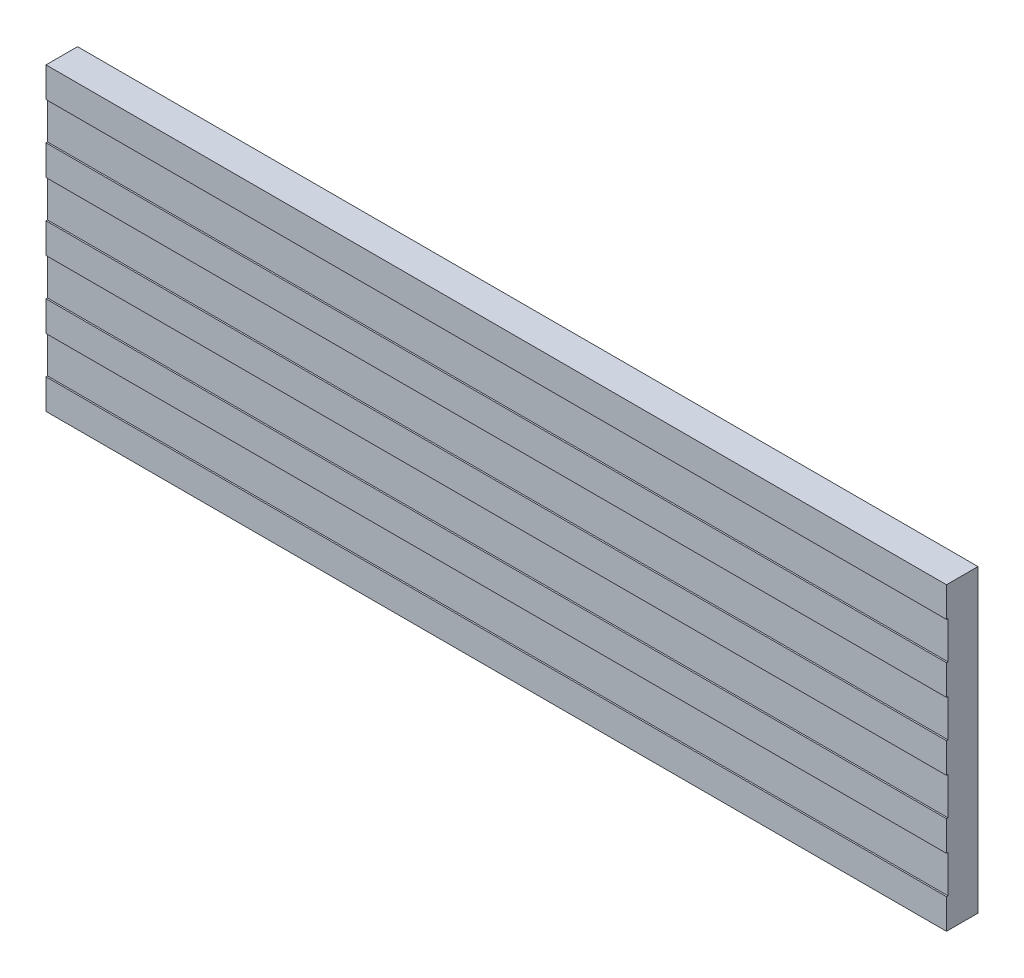
ISO-10303-21;
HEADER;
FILE_DESCRIPTION(('STEP AP214'),'2;1');
FILE_NAME('part.step','',(''),(''),'','','');
FILE_SCHEMA(('AUTOMOTIVE_DESIGN { 1 0 10303 214 1 1 1 1 }'));
ENDSEC;
DATA;
#1=APPLICATION_CONTEXT('core data for automotive mechanical design processes');
#2=APPLICATION_PROTOCOL_DEFINITION('international standard','automotive_design',2000,#1);
#3=PRODUCT_CONTEXT('',#1,'mechanical');
#4=PRODUCT('Part','Part','',(#3));
#5=PRODUCT_RELATED_PRODUCT_CATEGORY('part','',(#4));
#6=PRODUCT_DEFINITION_FORMATION('','',#4);
#7=PRODUCT_DEFINITION_CONTEXT('part definition',#1,'design');
#8=PRODUCT_DEFINITION('design','',#6,#7);
#9=PRODUCT_DEFINITION_SHAPE('','',#8);
#10=(LENGTH_UNIT() NAMED_UNIT(*) SI_UNIT(.MILLI.,.METRE.));
#11=(NAMED_UNIT(*) PLANE_ANGLE_UNIT() SI_UNIT($,.RADIAN.));
#12=(NAMED_UNIT(*) SI_UNIT($,.STERADIAN.) SOLID_ANGLE_UNIT());
#13=UNCERTAINTY_MEASURE_WITH_UNIT(LENGTH_MEASURE(1.E-05),#10,'distance_accuracy_value','');
#14=(GEOMETRIC_REPRESENTATION_CONTEXT(3) GLOBAL_UNCERTAINTY_ASSIGNED_CONTEXT((#13)) GLOBAL_UNIT_ASSIGNED_CONTEXT((#10,
#11,#12)) REPRESENTATION_CONTEXT('',''));
#15=CARTESIAN_POINT('',(0.,0.,0.));
#16=DIRECTION('',(0.,0.,1.));
#17=DIRECTION('',(1.,0.,0.));
#18=AXIS2_PLACEMENT_3D('',#15,#16,#17);
#19=CARTESIAN_POINT('',(0.,0.,20.));
#20=DIRECTION('',(0.,0.,1.));
#21=DIRECTION('',(1.,0.,0.));
#22=AXIS2_PLACEMENT_3D('',#19,#20,#21);
#23=PLANE('',#22);
#24=DIRECTION('',(0.,-1.,0.));
#25=VECTOR('',#24,1.);
#26=CARTESIAN_POINT('',(-45.0098837978771,19.9904232510125,20.));
#27=LINE('',#26,#25);
#28=CARTESIAN_POINT('',(-45.0098837978771,-135.009576748988,20.));
#29=VERTEX_POINT('',#28);
#30=CARTESIAN_POINT('',(-45.0098837978771,-160.009576748988,20.));
#31=VERTEX_POINT('',#30);
#32=EDGE_CURVE('E50',#29,#31,#27,.T.);
#33=ORIENTED_EDGE('',*,*,#32,.T.);
#34=DIRECTION('',(-1.,0.,0.));
#35=VECTOR('',#34,1.);
#36=CARTESIAN_POINT('',(554.990116202123,-160.009576748988,20.));
#37=LINE('',#36,#35);
#38=CARTESIAN_POINT('',(554.990116202123,-160.009576748988,20.));
#39=VERTEX_POINT('',#38);
#40=EDGE_CURVE('E191',#39,#31,#37,.T.);
#41=ORIENTED_EDGE('',*,*,#40,.F.);
#42=DIRECTION('',(0.,1.,0.));
#43=VECTOR('',#42,1.);
#44=CARTESIAN_POINT('',(554.990116202123,19.9904232510125,20.));
#45=LINE('',#44,#43);
#46=CARTESIAN_POINT('',(554.990116202123,-135.009576748988,20.));
#47=VERTEX_POINT('',#46);
#48=EDGE_CURVE('E36',#39,#47,#45,.T.);
#49=ORIENTED_EDGE('',*,*,#48,.T.);
#50=DIRECTION('',(1.,0.,0.));
#51=VECTOR('',#50,1.);
#52=CARTESIAN_POINT('',(-45.0098837978771,-135.009576748988,20.));
#53=LINE('',#52,#51);
#54=EDGE_CURVE('E55',#29,#47,#53,.T.);
#55=ORIENTED_EDGE('',*,*,#54,.F.);
#56=EDGE_LOOP('',(#33,#41,#49,#55));
#57=FACE_BOUND('',#56,.T.);
#58=ADVANCED_FACE('F32',(#57),#23,.T.);
#59=CARTESIAN_POINT('',(-45.0098837978771,-90.0095767489876,20.));
#60=VERTEX_POINT('',#59);
#61=CARTESIAN_POINT('',(-45.0098837978771,-115.009576748988,20.));
#62=VERTEX_POINT('',#61);
#63=EDGE_CURVE('E307',#60,#62,#27,.T.);
#64=ORIENTED_EDGE('',*,*,#63,.T.);
#65=DIRECTION('',(-1.,0.,0.));
#66=VECTOR('',#65,1.);
#67=CARTESIAN_POINT('',(-45.0098837978771,-115.009576748988,20.));
#68=LINE('',#67,#66);
#69=CARTESIAN_POINT('',(554.990116202123,-115.009576748988,20.));
#70=VERTEX_POINT('',#69);
#71=EDGE_CURVE('E196',#70,#62,#68,.T.);
#72=ORIENTED_EDGE('',*,*,#71,.F.);
#73=CARTESIAN_POINT('',(554.990116202123,-90.0095767489876,20.));
#74=VERTEX_POINT('',#73);
#75=EDGE_CURVE('E319',#70,#74,#45,.T.);
#76=ORIENTED_EDGE('',*,*,#75,.T.);
#77=DIRECTION('',(1.,0.,0.));
#78=VECTOR('',#77,1.);
#79=CARTESIAN_POINT('',(-45.0098837978771,-90.0095767489876,20.));
#80=LINE('',#79,#78);
#81=EDGE_CURVE('E223',#60,#74,#80,.T.);
#82=ORIENTED_EDGE('',*,*,#81,.F.);
#83=EDGE_LOOP('',(#64,#72,#76,#82));
#84=FACE_BOUND('',#83,.T.);
#85=ADVANCED_FACE('F361',(#84),#23,.T.);
#86=CARTESIAN_POINT('',(-45.0098837978771,-45.0095767489876,20.));
#87=VERTEX_POINT('',#86);
#88=CARTESIAN_POINT('',(-45.0098837978771,-70.0095767489876,20.));
#89=VERTEX_POINT('',#88);
#90=EDGE_CURVE('E305',#87,#89,#27,.T.);
#91=ORIENTED_EDGE('',*,*,#90,.T.);
#92=DIRECTION('',(-1.,0.,0.));
#93=VECTOR('',#92,1.);
#94=CARTESIAN_POINT('',(-45.0098837978771,-70.0095767489876,20.));
#95=LINE('',#94,#93);
#96=CARTESIAN_POINT('',(554.990116202123,-70.0095767489876,20.));
#97=VERTEX_POINT('',#96);
#98=EDGE_CURVE('E228',#97,#89,#95,.T.);
#99=ORIENTED_EDGE('',*,*,#98,.F.);
#100=CARTESIAN_POINT('',(554.990116202123,-45.0095767489875,20.));
#101=VERTEX_POINT('',#100);
#102=EDGE_CURVE('E310',#97,#101,#45,.T.);
#103=ORIENTED_EDGE('',*,*,#102,.T.);
#104=DIRECTION('',(1.,0.,0.));
#105=VECTOR('',#104,1.);
#106=CARTESIAN_POINT('',(554.990116202123,-45.0095767489875,20.));
#107=LINE('',#106,#105);
#108=EDGE_CURVE('E255',#87,#101,#107,.T.);
#109=ORIENTED_EDGE('',*,*,#108,.F.);
#110=EDGE_LOOP('',(#91,#99,#103,#109));
#111=FACE_BOUND('',#110,.T.);
#112=ADVANCED_FACE('F378',(#111),#23,.T.);
#113=CARTESIAN_POINT('',(-45.0098837978771,-0.00957674898752897,20.));
#114=VERTEX_POINT('',#113);
#115=CARTESIAN_POINT('',(-45.0098837978771,-25.0095767489876,20.));
#116=VERTEX_POINT('',#115);
#117=EDGE_CURVE('E294',#114,#116,#27,.T.);
#118=ORIENTED_EDGE('',*,*,#117,.T.);
#119=DIRECTION('',(-1.,0.,0.));
#120=VECTOR('',#119,1.);
#121=CARTESIAN_POINT('',(554.990116202123,-25.0095767489875,20.));
#122=LINE('',#121,#120);
#123=CARTESIAN_POINT('',(554.990116202123,-25.0095767489875,20.));
#124=VERTEX_POINT('',#123);
#125=EDGE_CURVE('E250',#124,#116,#122,.T.);
#126=ORIENTED_EDGE('',*,*,#125,.F.);
#127=CARTESIAN_POINT('',(554.990116202123,-0.00957674898752203,20.));
#128=VERTEX_POINT('',#127);
#129=EDGE_CURVE('E308',#124,#128,#45,.T.);
#130=ORIENTED_EDGE('',*,*,#129,.T.);
#131=DIRECTION('',(1.,0.,0.));
#132=VECTOR('',#131,1.);
#133=CARTESIAN_POINT('',(-45.0098837978771,-0.00957674898753244,20.));
#134=LINE('',#133,#132);
#135=EDGE_CURVE('E274',#114,#128,#134,.T.);
#136=ORIENTED_EDGE('',*,*,#135,.F.);
#137=EDGE_LOOP('',(#118,#126,#130,#136));
#138=FACE_BOUND('',#137,.T.);
#139=ADVANCED_FACE('F397',(#138),#23,.T.);
#140=CARTESIAN_POINT('',(-45.0098837978771,19.9904232510125,20.));
#141=DIRECTION('',(1.,0.,0.));
#142=DIRECTION('',(0.,1.,0.));
#143=AXIS2_PLACEMENT_3D('',#140,#141,#142);
#144=PLANE('',#143);
#145=DIRECTION('',(0.,-1.,0.));
#146=VECTOR('',#145,1.);
#147=CARTESIAN_POINT('',(-45.0098837978771,19.9904232510125,0.));
#148=LINE('',#147,#146);
#149=CARTESIAN_POINT('',(-45.0098837978771,19.9904232510125,0.));
#150=VERTEX_POINT('',#149);
#151=CARTESIAN_POINT('',(-45.0098837978771,-180.009576748988,0.));
#152=VERTEX_POINT('',#151);
#153=EDGE_CURVE('E302',#150,#152,#148,.T.);
#154=ORIENTED_EDGE('',*,*,#153,.T.);
#155=DIRECTION('',(0.,0.,-1.));
#156=VECTOR('',#155,1.);
#157=CARTESIAN_POINT('',(-45.0098837978771,-180.009576748988,20.));
#158=LINE('',#157,#156);
#159=CARTESIAN_POINT('',(-45.0098837978771,-180.009576748988,21.));
#160=VERTEX_POINT('',#159);
#161=EDGE_CURVE('E11',#160,#152,#158,.T.);
#162=ORIENTED_EDGE('',*,*,#161,.F.);
#163=DIRECTION('',(0.,-1.,0.));
#164=VECTOR('',#163,1.);
#165=CARTESIAN_POINT('',(-45.0098837978771,-180.009576748988,21.));
#166=LINE('',#165,#164);
#167=CARTESIAN_POINT('',(-45.0098837978771,-160.009576748988,21.));
#168=VERTEX_POINT('',#167);
#169=EDGE_CURVE('E181',#168,#160,#166,.T.);
#170=ORIENTED_EDGE('',*,*,#169,.F.);
#171=DIRECTION('',(0.,0.,-1.));
#172=VECTOR('',#171,1.);
#173=CARTESIAN_POINT('',(-45.0098837978771,-160.009576748988,21.));
#174=LINE('',#173,#172);
#175=EDGE_CURVE('E177',#168,#31,#174,.T.);
#176=ORIENTED_EDGE('',*,*,#175,.T.);
#177=ORIENTED_EDGE('',*,*,#32,.F.);
#178=DIRECTION('',(0.,0.,-1.));
#179=VECTOR('',#178,1.);
#180=CARTESIAN_POINT('',(-45.0098837978771,-135.009576748988,21.));
#181=LINE('',#180,#179);
#182=CARTESIAN_POINT('',(-45.0098837978771,-135.009576748988,21.));
#183=VERTEX_POINT('',#182);
#184=EDGE_CURVE('E220',#183,#29,#181,.T.);
#185=ORIENTED_EDGE('',*,*,#184,.F.);
#186=DIRECTION('',(0.,-1.,0.));
#187=VECTOR('',#186,1.);
#188=CARTESIAN_POINT('',(-45.0098837978771,-115.009576748988,21.));
#189=LINE('',#188,#187);
#190=CARTESIAN_POINT('',(-45.0098837978771,-115.009576748988,21.));
#191=VERTEX_POINT('',#190);
#192=EDGE_CURVE('E201',#191,#183,#189,.T.);
#193=ORIENTED_EDGE('',*,*,#192,.F.);
#194=DIRECTION('',(0.,0.,-1.));
#195=VECTOR('',#194,1.);
#196=CARTESIAN_POINT('',(-45.0098837978771,-115.009576748988,21.));
#197=LINE('',#196,#195);
#198=EDGE_CURVE('E209',#191,#62,#197,.T.);
#199=ORIENTED_EDGE('',*,*,#198,.T.);
#200=ORIENTED_EDGE('',*,*,#63,.F.);
#201=DIRECTION('',(0.,0.,-1.));
#202=VECTOR('',#201,1.);
#203=CARTESIAN_POINT('',(-45.0098837978771,-90.0095767489876,21.));
#204=LINE('',#203,#202);
#205=CARTESIAN_POINT('',(-45.0098837978771,-90.0095767489876,21.));
#206=VERTEX_POINT('',#205);
#207=EDGE_CURVE('E247',#206,#60,#204,.T.);
#208=ORIENTED_EDGE('',*,*,#207,.F.);
#209=DIRECTION('',(0.,-1.,0.));
#210=VECTOR('',#209,1.);
#211=CARTESIAN_POINT('',(-45.0098837978771,-70.0095767489876,21.));
#212=LINE('',#211,#210);
#213=CARTESIAN_POINT('',(-45.0098837978771,-70.0095767489876,21.));
#214=VERTEX_POINT('',#213);
#215=EDGE_CURVE('E224',#214,#206,#212,.T.);
#216=ORIENTED_EDGE('',*,*,#215,.F.);
#217=DIRECTION('',(0.,0.,-1.));
#218=VECTOR('',#217,1.);
#219=CARTESIAN_POINT('',(-45.0098837978771,-70.0095767489876,21.));
#220=LINE('',#219,#218);
#221=EDGE_CURVE('E234',#214,#89,#220,.T.);
#222=ORIENTED_EDGE('',*,*,#221,.T.);
#223=ORIENTED_EDGE('',*,*,#90,.F.);
#224=DIRECTION('',(0.,0.,-1.));
#225=VECTOR('',#224,1.);
#226=CARTESIAN_POINT('',(-45.0098837978771,-45.0095767489876,21.));
#227=LINE('',#226,#225);
#228=CARTESIAN_POINT('',(-45.0098837978771,-45.0095767489876,21.));
#229=VERTEX_POINT('',#228);
#230=EDGE_CURVE('E267',#229,#87,#227,.T.);
#231=ORIENTED_EDGE('',*,*,#230,.F.);
#232=DIRECTION('',(0.,-1.,0.));
#233=VECTOR('',#232,1.);
#234=CARTESIAN_POINT('',(-45.0098837978771,-25.0095767489876,21.));
#235=LINE('',#234,#233);
#236=CARTESIAN_POINT('',(-45.0098837978771,-25.0095767489876,21.));
#237=VERTEX_POINT('',#236);
#238=EDGE_CURVE('E257',#237,#229,#235,.T.);
#239=ORIENTED_EDGE('',*,*,#238,.F.);
#240=DIRECTION('',(0.,0.,-1.));
#241=VECTOR('',#240,1.);
#242=CARTESIAN_POINT('',(-45.0098837978771,-25.0095767489876,21.));
#243=LINE('',#242,#241);
#244=EDGE_CURVE('E269',#237,#116,#243,.T.);
#245=ORIENTED_EDGE('',*,*,#244,.T.);
#246=ORIENTED_EDGE('',*,*,#117,.F.);
#247=DIRECTION('',(0.,0.,-1.));
#248=VECTOR('',#247,1.);
#249=CARTESIAN_POINT('',(-45.0098837978771,-0.00957674898753244,21.));
#250=LINE('',#249,#248);
#251=CARTESIAN_POINT('',(-45.0098837978771,-0.00957674898753244,21.));
#252=VERTEX_POINT('',#251);
#253=EDGE_CURVE('E297',#252,#114,#250,.T.);
#254=ORIENTED_EDGE('',*,*,#253,.F.);
#255=DIRECTION('',(0.,-1.,0.));
#256=VECTOR('',#255,1.);
#257=CARTESIAN_POINT('',(-45.0098837978771,19.9904232510125,21.));
#258=LINE('',#257,#256);
#259=CARTESIAN_POINT('',(-45.0098837978771,19.9904232510125,21.));
#260=VERTEX_POINT('',#259);
#261=EDGE_CURVE('E275',#260,#252,#258,.T.);
#262=ORIENTED_EDGE('',*,*,#261,.F.);
#263=DIRECTION('',(0.,0.,-1.));
#264=VECTOR('',#263,1.);
#265=CARTESIAN_POINT('',(-45.0098837978771,19.9904232510125,20.));
#266=LINE('',#265,#264);
#267=EDGE_CURVE('E330',#260,#150,#266,.T.);
#268=ORIENTED_EDGE('',*,*,#267,.T.);
#269=EDGE_LOOP('',(#154,#162,#170,#176,#177,#185,#193,#199,#200,#208,#216,#222,#223,#231,#239,
#245,#246,#254,#262,#268));
#270=FACE_BOUND('',#269,.T.);
#271=ADVANCED_FACE('F34',(#270),#144,.F.);
#272=CARTESIAN_POINT('',(-45.0098837978771,-180.009576748988,20.));
#273=DIRECTION('',(0.,1.,0.));
#274=DIRECTION('',(0.,0.,1.));
#275=AXIS2_PLACEMENT_3D('',#272,#273,#274);
#276=PLANE('',#275);
#277=DIRECTION('',(1.,0.,0.));
#278=VECTOR('',#277,1.);
#279=CARTESIAN_POINT('',(-45.0098837978771,-180.009576748988,0.));
#280=LINE('',#279,#278);
#281=CARTESIAN_POINT('',(554.990116202123,-180.009576748988,0.));
#282=VERTEX_POINT('',#281);
#283=EDGE_CURVE('E327',#152,#282,#280,.T.);
#284=ORIENTED_EDGE('',*,*,#283,.T.);
#285=DIRECTION('',(0.,0.,-1.));
#286=VECTOR('',#285,1.);
#287=CARTESIAN_POINT('',(554.990116202123,-180.009576748988,20.));
#288=LINE('',#287,#286);
#289=CARTESIAN_POINT('',(554.990116202123,-180.009576748988,21.));
#290=VERTEX_POINT('',#289);
#291=EDGE_CURVE('E42',#290,#282,#288,.T.);
#292=ORIENTED_EDGE('',*,*,#291,.F.);
#293=DIRECTION('',(1.,0.,0.));
#294=VECTOR('',#293,1.);
#295=CARTESIAN_POINT('',(554.990116202123,-180.009576748988,21.));
#296=LINE('',#295,#294);
#297=EDGE_CURVE('E188',#160,#290,#296,.T.);
#298=ORIENTED_EDGE('',*,*,#297,.F.);
#299=ORIENTED_EDGE('',*,*,#161,.T.);
#300=EDGE_LOOP('',(#284,#292,#298,#299));
#301=FACE_BOUND('',#300,.T.);
#302=ADVANCED_FACE('F341',(#301),#276,.F.);
#303=CARTESIAN_POINT('',(554.990116202123,19.9904232510125,20.));
#304=DIRECTION('',(-1.,0.,0.));
#305=DIRECTION('',(0.,-1.,0.));
#306=AXIS2_PLACEMENT_3D('',#303,#304,#305);
#307=PLANE('',#306);
#308=DIRECTION('',(0.,1.,0.));
#309=VECTOR('',#308,1.);
#310=CARTESIAN_POINT('',(554.990116202123,19.9904232510125,0.));
#311=LINE('',#310,#309);
#312=CARTESIAN_POINT('',(554.990116202123,19.9904232510125,0.));
#313=VERTEX_POINT('',#312);
#314=EDGE_CURVE('E321',#282,#313,#311,.T.);
#315=ORIENTED_EDGE('',*,*,#314,.T.);
#316=DIRECTION('',(0.,0.,-1.));
#317=VECTOR('',#316,1.);
#318=CARTESIAN_POINT('',(554.990116202123,19.9904232510125,20.));
#319=LINE('',#318,#317);
#320=CARTESIAN_POINT('',(554.990116202123,19.9904232510125,21.));
#321=VERTEX_POINT('',#320);
#322=EDGE_CURVE('E332',#321,#313,#319,.T.);
#323=ORIENTED_EDGE('',*,*,#322,.F.);
#324=DIRECTION('',(0.,1.,0.));
#325=VECTOR('',#324,1.);
#326=CARTESIAN_POINT('',(554.990116202123,19.9904232510125,21.));
#327=LINE('',#326,#325);
#328=CARTESIAN_POINT('',(554.990116202123,-0.00957674898752203,21.));
#329=VERTEX_POINT('',#328);
#330=EDGE_CURVE('E280',#329,#321,#327,.T.);
#331=ORIENTED_EDGE('',*,*,#330,.F.);
#332=DIRECTION('',(0.,0.,-1.));
#333=VECTOR('',#332,1.);
#334=CARTESIAN_POINT('',(554.990116202123,-0.00957674898752203,21.));
#335=LINE('',#334,#333);
#336=EDGE_CURVE('E286',#329,#128,#335,.T.);
#337=ORIENTED_EDGE('',*,*,#336,.T.);
#338=ORIENTED_EDGE('',*,*,#129,.F.);
#339=DIRECTION('',(0.,0.,-1.));
#340=VECTOR('',#339,1.);
#341=CARTESIAN_POINT('',(554.990116202123,-25.0095767489875,21.));
#342=LINE('',#341,#340);
#343=CARTESIAN_POINT('',(554.990116202123,-25.0095767489875,21.));
#344=VERTEX_POINT('',#343);
#345=EDGE_CURVE('E272',#344,#124,#342,.T.);
#346=ORIENTED_EDGE('',*,*,#345,.F.);
#347=DIRECTION('',(0.,1.,0.));
#348=VECTOR('',#347,1.);
#349=CARTESIAN_POINT('',(554.990116202123,-25.0095767489875,21.));
#350=LINE('',#349,#348);
#351=CARTESIAN_POINT('',(554.990116202123,-45.0095767489875,21.));
#352=VERTEX_POINT('',#351);
#353=EDGE_CURVE('E251',#352,#344,#350,.T.);
#354=ORIENTED_EDGE('',*,*,#353,.F.);
#355=DIRECTION('',(0.,0.,-1.));
#356=VECTOR('',#355,1.);
#357=CARTESIAN_POINT('',(554.990116202123,-45.0095767489875,21.));
#358=LINE('',#357,#356);
#359=EDGE_CURVE('E261',#352,#101,#358,.T.);
#360=ORIENTED_EDGE('',*,*,#359,.T.);
#361=ORIENTED_EDGE('',*,*,#102,.F.);
#362=DIRECTION('',(0.,0.,-1.));
#363=VECTOR('',#362,1.);
#364=CARTESIAN_POINT('',(554.990116202123,-70.0095767489876,21.));
#365=LINE('',#364,#363);
#366=CARTESIAN_POINT('',(554.990116202123,-70.0095767489876,21.));
#367=VERTEX_POINT('',#366);
#368=EDGE_CURVE('E241',#367,#97,#365,.T.);
#369=ORIENTED_EDGE('',*,*,#368,.F.);
#370=DIRECTION('',(0.,1.,0.));
#371=VECTOR('',#370,1.);
#372=CARTESIAN_POINT('',(554.990116202123,-70.0095767489876,21.));
#373=LINE('',#372,#371);
#374=CARTESIAN_POINT('',(554.990116202123,-90.0095767489876,21.));
#375=VERTEX_POINT('',#374);
#376=EDGE_CURVE('E230',#375,#367,#373,.T.);
#377=ORIENTED_EDGE('',*,*,#376,.F.);
#378=DIRECTION('',(0.,0.,-1.));
#379=VECTOR('',#378,1.);
#380=CARTESIAN_POINT('',(554.990116202123,-90.0095767489876,21.));
#381=LINE('',#380,#379);
#382=EDGE_CURVE('E244',#375,#74,#381,.T.);
#383=ORIENTED_EDGE('',*,*,#382,.T.);
#384=ORIENTED_EDGE('',*,*,#75,.F.);
#385=DIRECTION('',(0.,0.,-1.));
#386=VECTOR('',#385,1.);
#387=CARTESIAN_POINT('',(554.990116202123,-115.009576748988,21.));
#388=LINE('',#387,#386);
#389=CARTESIAN_POINT('',(554.990116202123,-115.009576748988,21.));
#390=VERTEX_POINT('',#389);
#391=EDGE_CURVE('E215',#390,#70,#388,.T.);
#392=ORIENTED_EDGE('',*,*,#391,.F.);
#393=DIRECTION('',(0.,1.,0.));
#394=VECTOR('',#393,1.);
#395=CARTESIAN_POINT('',(554.990116202123,-115.009576748988,21.));
#396=LINE('',#395,#394);
#397=CARTESIAN_POINT('',(554.990116202123,-135.009576748988,21.));
#398=VERTEX_POINT('',#397);
#399=EDGE_CURVE('E206',#398,#390,#396,.T.);
#400=ORIENTED_EDGE('',*,*,#399,.F.);
#401=DIRECTION('',(0.,0.,-1.));
#402=VECTOR('',#401,1.);
#403=CARTESIAN_POINT('',(554.990116202123,-135.009576748988,21.));
#404=LINE('',#403,#402);
#405=EDGE_CURVE('E218',#398,#47,#404,.T.);
#406=ORIENTED_EDGE('',*,*,#405,.T.);
#407=ORIENTED_EDGE('',*,*,#48,.F.);
#408=DIRECTION('',(0.,0.,-1.));
#409=VECTOR('',#408,1.);
#410=CARTESIAN_POINT('',(554.990116202123,-160.009576748988,21.));
#411=LINE('',#410,#409);
#412=CARTESIAN_POINT('',(554.990116202123,-160.009576748988,21.));
#413=VERTEX_POINT('',#412);
#414=EDGE_CURVE('E175',#413,#39,#411,.T.);
#415=ORIENTED_EDGE('',*,*,#414,.F.);
#416=DIRECTION('',(0.,1.,0.));
#417=VECTOR('',#416,1.);
#418=CARTESIAN_POINT('',(554.990116202123,-180.009576748988,21.));
#419=LINE('',#418,#417);
#420=EDGE_CURVE('E182',#290,#413,#419,.T.);
#421=ORIENTED_EDGE('',*,*,#420,.F.);
#422=ORIENTED_EDGE('',*,*,#291,.T.);
#423=EDGE_LOOP('',(#315,#323,#331,#337,#338,#346,#354,#360,#361,#369,#377,#383,#384,#392,#400,
#406,#407,#415,#421,#422));
#424=FACE_BOUND('',#423,.T.);
#425=ADVANCED_FACE('F193',(#424),#307,.F.);
#426=CARTESIAN_POINT('',(-45.0098837978771,19.9904232510125,20.));
#427=DIRECTION('',(0.,-1.,0.));
#428=DIRECTION('',(0.,0.,-1.));
#429=AXIS2_PLACEMENT_3D('',#426,#427,#428);
#430=PLANE('',#429);
#431=DIRECTION('',(-1.,0.,0.));
#432=VECTOR('',#431,1.);
#433=CARTESIAN_POINT('',(-45.0098837978771,19.9904232510125,0.));
#434=LINE('',#433,#432);
#435=EDGE_CURVE('E320',#313,#150,#434,.T.);
#436=ORIENTED_EDGE('',*,*,#435,.T.);
#437=ORIENTED_EDGE('',*,*,#267,.F.);
#438=DIRECTION('',(-1.,0.,0.));
#439=VECTOR('',#438,1.);
#440=CARTESIAN_POINT('',(-45.0098837978771,19.9904232510125,21.));
#441=LINE('',#440,#439);
#442=EDGE_CURVE('E283',#321,#260,#441,.T.);
#443=ORIENTED_EDGE('',*,*,#442,.F.);
#444=ORIENTED_EDGE('',*,*,#322,.T.);
#445=EDGE_LOOP('',(#436,#437,#443,#444));
#446=FACE_BOUND('',#445,.T.);
#447=ADVANCED_FACE('F406',(#446),#430,.F.);
#448=CARTESIAN_POINT('',(0.,0.,0.));
#449=DIRECTION('',(0.,0.,1.));
#450=DIRECTION('',(1.,0.,0.));
#451=AXIS2_PLACEMENT_3D('',#448,#449,#450);
#452=PLANE('',#451);
#453=ORIENTED_EDGE('',*,*,#153,.F.);
#454=ORIENTED_EDGE('',*,*,#435,.F.);
#455=ORIENTED_EDGE('',*,*,#314,.F.);
#456=ORIENTED_EDGE('',*,*,#283,.F.);
#457=EDGE_LOOP('',(#453,#454,#455,#456));
#458=FACE_BOUND('',#457,.T.);
#459=ADVANCED_FACE('F338',(#458),#452,.F.);
#460=CARTESIAN_POINT('',(-45.0098837978771,-0.00957674898753244,21.));
#461=DIRECTION('',(0.,1.,0.));
#462=DIRECTION('',(-1.,0.,0.));
#463=AXIS2_PLACEMENT_3D('',#460,#461,#462);
#464=PLANE('',#463);
#465=ORIENTED_EDGE('',*,*,#135,.T.);
#466=ORIENTED_EDGE('',*,*,#336,.F.);
#467=DIRECTION('',(1.,0.,0.));
#468=VECTOR('',#467,1.);
#469=CARTESIAN_POINT('',(-45.0098837978771,-0.00957674898753244,21.));
#470=LINE('',#469,#468);
#471=EDGE_CURVE('E278',#252,#329,#470,.T.);
#472=ORIENTED_EDGE('',*,*,#471,.F.);
#473=ORIENTED_EDGE('',*,*,#253,.T.);
#474=EDGE_LOOP('',(#465,#466,#472,#473));
#475=FACE_BOUND('',#474,.T.);
#476=ADVANCED_FACE('F400',(#475),#464,.F.);
#477=CARTESIAN_POINT('',(0.,0.,21.));
#478=DIRECTION('',(0.,0.,1.));
#479=DIRECTION('',(1.,0.,0.));
#480=AXIS2_PLACEMENT_3D('',#477,#478,#479);
#481=PLANE('',#480);
#482=ORIENTED_EDGE('',*,*,#261,.T.);
#483=ORIENTED_EDGE('',*,*,#471,.T.);
#484=ORIENTED_EDGE('',*,*,#330,.T.);
#485=ORIENTED_EDGE('',*,*,#442,.T.);
#486=EDGE_LOOP('',(#482,#483,#484,#485));
#487=FACE_BOUND('',#486,.T.);
#488=ADVANCED_FACE('F404',(#487),#481,.T.);
#489=CARTESIAN_POINT('',(554.990116202123,-25.0095767489875,21.));
#490=DIRECTION('',(0.,-1.,0.));
#491=DIRECTION('',(1.,0.,0.));
#492=AXIS2_PLACEMENT_3D('',#489,#490,#491);
#493=PLANE('',#492);
#494=ORIENTED_EDGE('',*,*,#125,.T.);
#495=ORIENTED_EDGE('',*,*,#244,.F.);
#496=DIRECTION('',(-1.,0.,0.));
#497=VECTOR('',#496,1.);
#498=CARTESIAN_POINT('',(554.990116202123,-25.0095767489875,21.));
#499=LINE('',#498,#497);
#500=EDGE_CURVE('E254',#344,#237,#499,.T.);
#501=ORIENTED_EDGE('',*,*,#500,.F.);
#502=ORIENTED_EDGE('',*,*,#345,.T.);
#503=EDGE_LOOP('',(#494,#495,#501,#502));
#504=FACE_BOUND('',#503,.T.);
#505=ADVANCED_FACE('F458',(#504),#493,.F.);
#506=CARTESIAN_POINT('',(554.990116202123,-45.0095767489875,21.));
#507=DIRECTION('',(0.,1.,0.));
#508=DIRECTION('',(-1.,0.,0.));
#509=AXIS2_PLACEMENT_3D('',#506,#507,#508);
#510=PLANE('',#509);
#511=ORIENTED_EDGE('',*,*,#108,.T.);
#512=ORIENTED_EDGE('',*,*,#359,.F.);
#513=DIRECTION('',(1.,0.,0.));
#514=VECTOR('',#513,1.);
#515=CARTESIAN_POINT('',(554.990116202123,-45.0095767489875,21.));
#516=LINE('',#515,#514);
#517=EDGE_CURVE('E259',#229,#352,#516,.T.);
#518=ORIENTED_EDGE('',*,*,#517,.F.);
#519=ORIENTED_EDGE('',*,*,#230,.T.);
#520=EDGE_LOOP('',(#511,#512,#518,#519));
#521=FACE_BOUND('',#520,.T.);
#522=ADVANCED_FACE('F382',(#521),#510,.F.);
#523=CARTESIAN_POINT('',(0.,0.,21.));
#524=DIRECTION('',(0.,0.,-1.));
#525=DIRECTION('',(-1.,0.,0.));
#526=AXIS2_PLACEMENT_3D('',#523,#524,#525);
#527=PLANE('',#526);
#528=ORIENTED_EDGE('',*,*,#353,.T.);
#529=ORIENTED_EDGE('',*,*,#500,.T.);
#530=ORIENTED_EDGE('',*,*,#238,.T.);
#531=ORIENTED_EDGE('',*,*,#517,.T.);
#532=EDGE_LOOP('',(#528,#529,#530,#531));
#533=FACE_BOUND('',#532,.T.);
#534=ADVANCED_FACE('F388',(#533),#527,.F.);
#535=CARTESIAN_POINT('',(-45.0098837978771,-90.0095767489876,21.));
#536=DIRECTION('',(0.,1.,0.));
#537=DIRECTION('',(0.,0.,1.));
#538=AXIS2_PLACEMENT_3D('',#535,#536,#537);
#539=PLANE('',#538);
#540=ORIENTED_EDGE('',*,*,#81,.T.);
#541=ORIENTED_EDGE('',*,*,#382,.F.);
#542=DIRECTION('',(1.,0.,0.));
#543=VECTOR('',#542,1.);
#544=CARTESIAN_POINT('',(-45.0098837978771,-90.0095767489876,21.));
#545=LINE('',#544,#543);
#546=EDGE_CURVE('E227',#206,#375,#545,.T.);
#547=ORIENTED_EDGE('',*,*,#546,.F.);
#548=ORIENTED_EDGE('',*,*,#207,.T.);
#549=EDGE_LOOP('',(#540,#541,#547,#548));
#550=FACE_BOUND('',#549,.T.);
#551=ADVANCED_FACE('F364',(#550),#539,.F.);
#552=CARTESIAN_POINT('',(-45.0098837978771,-70.0095767489876,21.));
#553=DIRECTION('',(0.,-1.,0.));
#554=DIRECTION('',(0.,0.,-1.));
#555=AXIS2_PLACEMENT_3D('',#552,#553,#554);
#556=PLANE('',#555);
#557=ORIENTED_EDGE('',*,*,#98,.T.);
#558=ORIENTED_EDGE('',*,*,#221,.F.);
#559=DIRECTION('',(-1.,0.,0.));
#560=VECTOR('',#559,1.);
#561=CARTESIAN_POINT('',(-45.0098837978771,-70.0095767489876,21.));
#562=LINE('',#561,#560);
#563=EDGE_CURVE('E232',#367,#214,#562,.T.);
#564=ORIENTED_EDGE('',*,*,#563,.F.);
#565=ORIENTED_EDGE('',*,*,#368,.T.);
#566=EDGE_LOOP('',(#557,#558,#564,#565));
#567=FACE_BOUND('',#566,.T.);
#568=ADVANCED_FACE('F375',(#567),#556,.F.);
#569=CARTESIAN_POINT('',(0.,0.,21.));
#570=DIRECTION('',(0.,0.,1.));
#571=DIRECTION('',(1.,0.,0.));
#572=AXIS2_PLACEMENT_3D('',#569,#570,#571);
#573=PLANE('',#572);
#574=ORIENTED_EDGE('',*,*,#215,.T.);
#575=ORIENTED_EDGE('',*,*,#546,.T.);
#576=ORIENTED_EDGE('',*,*,#376,.T.);
#577=ORIENTED_EDGE('',*,*,#563,.T.);
#578=EDGE_LOOP('',(#574,#575,#576,#577));
#579=FACE_BOUND('',#578,.T.);
#580=ADVANCED_FACE('F369',(#579),#573,.T.);
#581=CARTESIAN_POINT('',(-45.0098837978771,-135.009576748988,21.));
#582=DIRECTION('',(0.,1.,0.));
#583=DIRECTION('',(0.,0.,1.));
#584=AXIS2_PLACEMENT_3D('',#581,#582,#583);
#585=PLANE('',#584);
#586=ORIENTED_EDGE('',*,*,#54,.T.);
#587=ORIENTED_EDGE('',*,*,#405,.F.);
#588=DIRECTION('',(1.,0.,0.));
#589=VECTOR('',#588,1.);
#590=CARTESIAN_POINT('',(-45.0098837978771,-135.009576748988,21.));
#591=LINE('',#590,#589);
#592=EDGE_CURVE('E204',#183,#398,#591,.T.);
#593=ORIENTED_EDGE('',*,*,#592,.F.);
#594=ORIENTED_EDGE('',*,*,#184,.T.);
#595=EDGE_LOOP('',(#586,#587,#593,#594));
#596=FACE_BOUND('',#595,.T.);
#597=ADVANCED_FACE('F347',(#596),#585,.F.);
#598=CARTESIAN_POINT('',(-45.0098837978771,-115.009576748988,21.));
#599=DIRECTION('',(0.,-1.,0.));
#600=DIRECTION('',(0.,0.,-1.));
#601=AXIS2_PLACEMENT_3D('',#598,#599,#600);
#602=PLANE('',#601);
#603=ORIENTED_EDGE('',*,*,#71,.T.);
#604=ORIENTED_EDGE('',*,*,#198,.F.);
#605=DIRECTION('',(-1.,0.,0.));
#606=VECTOR('',#605,1.);
#607=CARTESIAN_POINT('',(-45.0098837978771,-115.009576748988,21.));
#608=LINE('',#607,#606);
#609=EDGE_CURVE('E208',#390,#191,#608,.T.);
#610=ORIENTED_EDGE('',*,*,#609,.F.);
#611=ORIENTED_EDGE('',*,*,#391,.T.);
#612=EDGE_LOOP('',(#603,#604,#610,#611));
#613=FACE_BOUND('',#612,.T.);
#614=ADVANCED_FACE('F357',(#613),#602,.F.);
#615=CARTESIAN_POINT('',(0.,0.,21.));
#616=DIRECTION('',(0.,0.,1.));
#617=DIRECTION('',(1.,0.,0.));
#618=AXIS2_PLACEMENT_3D('',#615,#616,#617);
#619=PLANE('',#618);
#620=ORIENTED_EDGE('',*,*,#192,.T.);
#621=ORIENTED_EDGE('',*,*,#592,.T.);
#622=ORIENTED_EDGE('',*,*,#399,.T.);
#623=ORIENTED_EDGE('',*,*,#609,.T.);
#624=EDGE_LOOP('',(#620,#621,#622,#623));
#625=FACE_BOUND('',#624,.T.);
#626=ADVANCED_FACE('F351',(#625),#619,.T.);
#627=CARTESIAN_POINT('',(554.990116202123,-160.009576748988,21.));
#628=DIRECTION('',(0.,-1.,0.));
#629=DIRECTION('',(1.,0.,0.));
#630=AXIS2_PLACEMENT_3D('',#627,#628,#629);
#631=PLANE('',#630);
#632=ORIENTED_EDGE('',*,*,#40,.T.);
#633=ORIENTED_EDGE('',*,*,#175,.F.);
#634=DIRECTION('',(-1.,0.,0.));
#635=VECTOR('',#634,1.);
#636=CARTESIAN_POINT('',(554.990116202123,-160.009576748988,21.));
#637=LINE('',#636,#635);
#638=EDGE_CURVE('E171',#413,#168,#637,.T.);
#639=ORIENTED_EDGE('',*,*,#638,.F.);
#640=ORIENTED_EDGE('',*,*,#414,.T.);
#641=EDGE_LOOP('',(#632,#633,#639,#640));
#642=FACE_BOUND('',#641,.T.);
#643=ADVANCED_FACE('F173',(#642),#631,.F.);
#644=CARTESIAN_POINT('',(0.,0.,21.));
#645=DIRECTION('',(0.,0.,1.));
#646=DIRECTION('',(1.,0.,0.));
#647=AXIS2_PLACEMENT_3D('',#644,#645,#646);
#648=PLANE('',#647);
#649=ORIENTED_EDGE('',*,*,#420,.T.);
#650=ORIENTED_EDGE('',*,*,#638,.T.);
#651=ORIENTED_EDGE('',*,*,#169,.T.);
#652=ORIENTED_EDGE('',*,*,#297,.T.);
#653=EDGE_LOOP('',(#649,#650,#651,#652));
#654=FACE_BOUND('',#653,.T.);
#655=ADVANCED_FACE('F186',(#654),#648,.T.);
#656=CLOSED_SHELL('',(#58,#85,#112,#139,#271,#302,#425,#447,#459,#476,#488,#505,#522,#534,#551,
#568,#580,#597,#614,#626,#643,#655));
#657=MANIFOLD_SOLID_BREP('B2',#656);
#658=ADVANCED_BREP_SHAPE_REPRESENTATION('',(#18,#657),#14);
#659=SHAPE_DEFINITION_REPRESENTATION(#9,#658);
ENDSEC;
END-ISO-10303-21;
